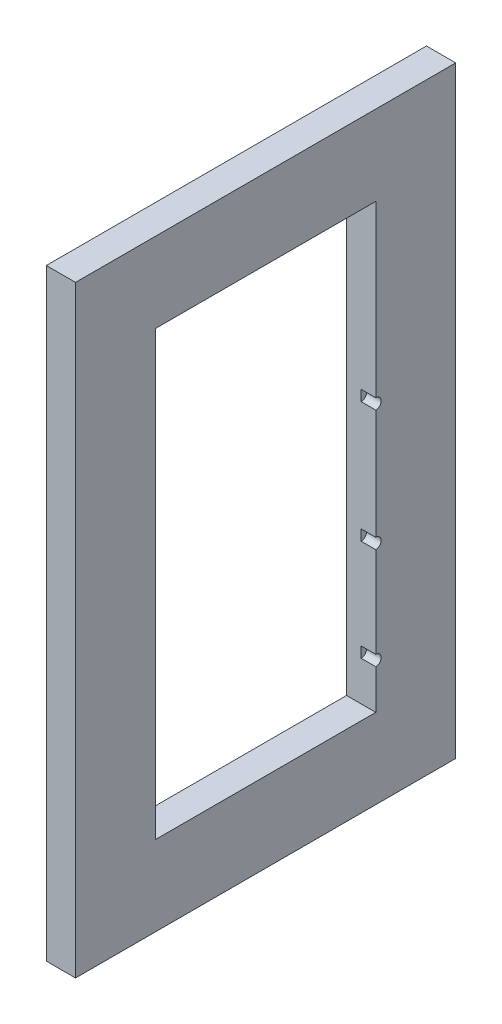
ISO-10303-21;
HEADER;
FILE_DESCRIPTION(('STEP AP214'),'2;1');
FILE_NAME('part.step','',(''),(''),'','','');
FILE_SCHEMA(('AUTOMOTIVE_DESIGN { 1 0 10303 214 1 1 1 1 }'));
ENDSEC;
DATA;
#1=APPLICATION_CONTEXT('core data for automotive mechanical design processes');
#2=APPLICATION_PROTOCOL_DEFINITION('international standard','automotive_design',2000,#1);
#3=PRODUCT_CONTEXT('',#1,'mechanical');
#4=PRODUCT('Part','Part','',(#3));
#5=PRODUCT_RELATED_PRODUCT_CATEGORY('part','',(#4));
#6=PRODUCT_DEFINITION_FORMATION('','',#4);
#7=PRODUCT_DEFINITION_CONTEXT('part definition',#1,'design');
#8=PRODUCT_DEFINITION('design','',#6,#7);
#9=PRODUCT_DEFINITION_SHAPE('','',#8);
#10=(LENGTH_UNIT() NAMED_UNIT(*) SI_UNIT(.MILLI.,.METRE.));
#11=(NAMED_UNIT(*) PLANE_ANGLE_UNIT() SI_UNIT($,.RADIAN.));
#12=(NAMED_UNIT(*) SI_UNIT($,.STERADIAN.) SOLID_ANGLE_UNIT());
#13=UNCERTAINTY_MEASURE_WITH_UNIT(LENGTH_MEASURE(1.E-05),#10,'distance_accuracy_value','');
#14=(GEOMETRIC_REPRESENTATION_CONTEXT(3) GLOBAL_UNCERTAINTY_ASSIGNED_CONTEXT((#13)) GLOBAL_UNIT_ASSIGNED_CONTEXT((#10,
#11,#12)) REPRESENTATION_CONTEXT('',''));
#15=CARTESIAN_POINT('',(0.,0.,0.));
#16=DIRECTION('',(0.,0.,1.));
#17=DIRECTION('',(1.,0.,0.));
#18=AXIS2_PLACEMENT_3D('',#15,#16,#17);
#19=CARTESIAN_POINT('',(15.,0.,0.));
#20=DIRECTION('',(-1.,0.,0.));
#21=DIRECTION('',(0.,0.,1.));
#22=AXIS2_PLACEMENT_3D('',#19,#20,#21);
#23=PLANE('',#22);
#24=DIRECTION('',(0.,0.,-1.));
#25=VECTOR('',#24,1.);
#26=CARTESIAN_POINT('',(15.,0.,0.));
#27=LINE('',#26,#25);
#28=CARTESIAN_POINT('',(15.,0.,195.));
#29=VERTEX_POINT('',#28);
#30=CARTESIAN_POINT('',(15.,0.,0.));
#31=VERTEX_POINT('',#30);
#32=EDGE_CURVE('E296',#29,#31,#27,.T.);
#33=ORIENTED_EDGE('',*,*,#32,.T.);
#34=DIRECTION('',(0.,1.,0.));
#35=VECTOR('',#34,1.);
#36=CARTESIAN_POINT('',(15.,0.,0.));
#37=LINE('',#36,#35);
#38=CARTESIAN_POINT('',(15.,309.,0.));
#39=VERTEX_POINT('',#38);
#40=EDGE_CURVE('E313',#31,#39,#37,.T.);
#41=ORIENTED_EDGE('',*,*,#40,.T.);
#42=DIRECTION('',(0.,0.,1.));
#43=VECTOR('',#42,1.);
#44=CARTESIAN_POINT('',(15.,309.,0.));
#45=LINE('',#44,#43);
#46=CARTESIAN_POINT('',(15.,309.,195.));
#47=VERTEX_POINT('',#46);
#48=EDGE_CURVE('E286',#39,#47,#45,.T.);
#49=ORIENTED_EDGE('',*,*,#48,.T.);
#50=DIRECTION('',(0.,-1.,0.));
#51=VECTOR('',#50,1.);
#52=CARTESIAN_POINT('',(15.,0.,195.));
#53=LINE('',#52,#51);
#54=EDGE_CURVE('E304',#47,#29,#53,.T.);
#55=ORIENTED_EDGE('',*,*,#54,.T.);
#56=EDGE_LOOP('',(#33,#41,#49,#55));
#57=FACE_BOUND('',#56,.T.);
#58=DIRECTION('',(0.,1.,0.));
#59=VECTOR('',#58,1.);
#60=CARTESIAN_POINT('',(15.,41.,41.));
#61=LINE('',#60,#59);
#62=CARTESIAN_POINT('',(15.,66.7499999999999,41.));
#63=VERTEX_POINT('',#62);
#64=CARTESIAN_POINT('',(15.,113.25,41.));
#65=VERTEX_POINT('',#64);
#66=EDGE_CURVE('E180',#63,#65,#61,.T.);
#67=ORIENTED_EDGE('',*,*,#66,.F.);
#68=CARTESIAN_POINT('',(15.,63.9999999999999,41.));
#69=DIRECTION('',(1.,0.,0.));
#70=DIRECTION('',(0.,0.,-1.));
#71=AXIS2_PLACEMENT_3D('',#68,#69,#70);
#72=CIRCLE('',#71,2.75000000000001);
#73=CARTESIAN_POINT('',(15.,61.2499999999999,41.));
#74=VERTEX_POINT('',#73);
#75=EDGE_CURVE('E199',#74,#63,#72,.T.);
#76=ORIENTED_EDGE('',*,*,#75,.F.);
#77=CARTESIAN_POINT('',(15.,41.,41.));
#78=VERTEX_POINT('',#77);
#79=EDGE_CURVE('E177',#78,#74,#61,.T.);
#80=ORIENTED_EDGE('',*,*,#79,.F.);
#81=DIRECTION('',(0.,0.,-1.));
#82=VECTOR('',#81,1.);
#83=CARTESIAN_POINT('',(15.,41.,154.));
#84=LINE('',#83,#82);
#85=CARTESIAN_POINT('',(15.,41.,154.));
#86=VERTEX_POINT('',#85);
#87=EDGE_CURVE('E175',#86,#78,#84,.T.);
#88=ORIENTED_EDGE('',*,*,#87,.F.);
#89=DIRECTION('',(0.,-1.,0.));
#90=VECTOR('',#89,1.);
#91=CARTESIAN_POINT('',(15.,41.,154.));
#92=LINE('',#91,#90);
#93=CARTESIAN_POINT('',(15.,268.,154.));
#94=VERTEX_POINT('',#93);
#95=EDGE_CURVE('E190',#94,#86,#92,.T.);
#96=ORIENTED_EDGE('',*,*,#95,.F.);
#97=DIRECTION('',(0.,0.,1.));
#98=VECTOR('',#97,1.);
#99=CARTESIAN_POINT('',(15.,268.,154.));
#100=LINE('',#99,#98);
#101=CARTESIAN_POINT('',(15.,268.,41.));
#102=VERTEX_POINT('',#101);
#103=EDGE_CURVE('E172',#102,#94,#100,.T.);
#104=ORIENTED_EDGE('',*,*,#103,.F.);
#105=CARTESIAN_POINT('',(15.,180.75,41.));
#106=VERTEX_POINT('',#105);
#107=EDGE_CURVE('E163',#106,#102,#61,.T.);
#108=ORIENTED_EDGE('',*,*,#107,.F.);
#109=CARTESIAN_POINT('',(15.,178.,41.));
#110=DIRECTION('',(1.,0.,0.));
#111=DIRECTION('',(0.,0.,-1.));
#112=AXIS2_PLACEMENT_3D('',#109,#110,#111);
#113=CIRCLE('',#112,2.75000000000001);
#114=CARTESIAN_POINT('',(15.,175.25,41.));
#115=VERTEX_POINT('',#114);
#116=EDGE_CURVE('E145',#115,#106,#113,.T.);
#117=ORIENTED_EDGE('',*,*,#116,.F.);
#118=CARTESIAN_POINT('',(15.,118.75,41.));
#119=VERTEX_POINT('',#118);
#120=EDGE_CURVE('E174',#119,#115,#61,.T.);
#121=ORIENTED_EDGE('',*,*,#120,.F.);
#122=CARTESIAN_POINT('',(15.,116.,41.));
#123=DIRECTION('',(1.,0.,0.));
#124=DIRECTION('',(0.,0.,-1.));
#125=AXIS2_PLACEMENT_3D('',#122,#123,#124);
#126=CIRCLE('',#125,2.75000000000001);
#127=EDGE_CURVE('E200',#65,#119,#126,.T.);
#128=ORIENTED_EDGE('',*,*,#127,.F.);
#129=EDGE_LOOP('',(#67,#76,#80,#88,#96,#104,#108,#117,#121,#128));
#130=FACE_BOUND('',#129,.T.);
#131=ADVANCED_FACE('F44',(#57,#130),#23,.F.);
#132=CARTESIAN_POINT('',(0.,0.,0.));
#133=DIRECTION('',(-1.,0.,0.));
#134=DIRECTION('',(0.,0.,1.));
#135=AXIS2_PLACEMENT_3D('',#132,#133,#134);
#136=PLANE('',#135);
#137=DIRECTION('',(0.,0.,-1.));
#138=VECTOR('',#137,1.);
#139=CARTESIAN_POINT('',(0.,0.,0.));
#140=LINE('',#139,#138);
#141=CARTESIAN_POINT('',(0.,0.,195.));
#142=VERTEX_POINT('',#141);
#143=CARTESIAN_POINT('',(0.,0.,0.));
#144=VERTEX_POINT('',#143);
#145=EDGE_CURVE('E282',#142,#144,#140,.T.);
#146=ORIENTED_EDGE('',*,*,#145,.F.);
#147=DIRECTION('',(0.,-1.,0.));
#148=VECTOR('',#147,1.);
#149=CARTESIAN_POINT('',(0.,0.,195.));
#150=LINE('',#149,#148);
#151=CARTESIAN_POINT('',(0.,309.,195.));
#152=VERTEX_POINT('',#151);
#153=EDGE_CURVE('E292',#152,#142,#150,.T.);
#154=ORIENTED_EDGE('',*,*,#153,.F.);
#155=DIRECTION('',(0.,0.,1.));
#156=VECTOR('',#155,1.);
#157=CARTESIAN_POINT('',(0.,309.,0.));
#158=LINE('',#157,#156);
#159=CARTESIAN_POINT('',(0.,309.,0.));
#160=VERTEX_POINT('',#159);
#161=EDGE_CURVE('E281',#160,#152,#158,.T.);
#162=ORIENTED_EDGE('',*,*,#161,.F.);
#163=DIRECTION('',(0.,1.,0.));
#164=VECTOR('',#163,1.);
#165=CARTESIAN_POINT('',(0.,0.,0.));
#166=LINE('',#165,#164);
#167=EDGE_CURVE('E271',#144,#160,#166,.T.);
#168=ORIENTED_EDGE('',*,*,#167,.F.);
#169=EDGE_LOOP('',(#146,#154,#162,#168));
#170=FACE_BOUND('',#169,.T.);
#171=DIRECTION('',(0.,-1.,0.));
#172=VECTOR('',#171,1.);
#173=CARTESIAN_POINT('',(0.,41.,154.));
#174=LINE('',#173,#172);
#175=CARTESIAN_POINT('',(0.,268.,154.));
#176=VERTEX_POINT('',#175);
#177=CARTESIAN_POINT('',(0.,41.,154.));
#178=VERTEX_POINT('',#177);
#179=EDGE_CURVE('E181',#176,#178,#174,.T.);
#180=ORIENTED_EDGE('',*,*,#179,.T.);
#181=DIRECTION('',(0.,0.,-1.));
#182=VECTOR('',#181,1.);
#183=CARTESIAN_POINT('',(0.,41.,154.));
#184=LINE('',#183,#182);
#185=CARTESIAN_POINT('',(0.,41.,41.));
#186=VERTEX_POINT('',#185);
#187=EDGE_CURVE('E349',#178,#186,#184,.T.);
#188=ORIENTED_EDGE('',*,*,#187,.T.);
#189=DIRECTION('',(0.,1.,0.));
#190=VECTOR('',#189,1.);
#191=CARTESIAN_POINT('',(0.,41.,41.));
#192=LINE('',#191,#190);
#193=CARTESIAN_POINT('',(0.,268.,41.));
#194=VERTEX_POINT('',#193);
#195=EDGE_CURVE('E345',#186,#194,#192,.T.);
#196=ORIENTED_EDGE('',*,*,#195,.T.);
#197=DIRECTION('',(0.,0.,1.));
#198=VECTOR('',#197,1.);
#199=CARTESIAN_POINT('',(0.,268.,154.));
#200=LINE('',#199,#198);
#201=EDGE_CURVE('E341',#194,#176,#200,.T.);
#202=ORIENTED_EDGE('',*,*,#201,.T.);
#203=EDGE_LOOP('',(#180,#188,#196,#202));
#204=FACE_BOUND('',#203,.T.);
#205=ADVANCED_FACE('F240',(#170,#204),#136,.T.);
#206=CARTESIAN_POINT('',(15.,0.,0.));
#207=DIRECTION('',(0.,1.,0.));
#208=DIRECTION('',(0.,0.,1.));
#209=AXIS2_PLACEMENT_3D('',#206,#207,#208);
#210=PLANE('',#209);
#211=ORIENTED_EDGE('',*,*,#145,.T.);
#212=DIRECTION('',(-1.,0.,0.));
#213=VECTOR('',#212,1.);
#214=CARTESIAN_POINT('',(15.,0.,0.));
#215=LINE('',#214,#213);
#216=EDGE_CURVE('E276',#31,#144,#215,.T.);
#217=ORIENTED_EDGE('',*,*,#216,.F.);
#218=ORIENTED_EDGE('',*,*,#32,.F.);
#219=DIRECTION('',(-1.,0.,0.));
#220=VECTOR('',#219,1.);
#221=CARTESIAN_POINT('',(15.,0.,195.));
#222=LINE('',#221,#220);
#223=EDGE_CURVE('E300',#29,#142,#222,.T.);
#224=ORIENTED_EDGE('',*,*,#223,.T.);
#225=EDGE_LOOP('',(#211,#217,#218,#224));
#226=FACE_BOUND('',#225,.T.);
#227=ADVANCED_FACE('F46',(#226),#210,.F.);
#228=CARTESIAN_POINT('',(15.,0.,0.));
#229=DIRECTION('',(0.,0.,1.));
#230=DIRECTION('',(1.,0.,0.));
#231=AXIS2_PLACEMENT_3D('',#228,#229,#230);
#232=PLANE('',#231);
#233=ORIENTED_EDGE('',*,*,#167,.T.);
#234=DIRECTION('',(-1.,0.,0.));
#235=VECTOR('',#234,1.);
#236=CARTESIAN_POINT('',(15.,309.,0.));
#237=LINE('',#236,#235);
#238=EDGE_CURVE('E273',#39,#160,#237,.T.);
#239=ORIENTED_EDGE('',*,*,#238,.F.);
#240=ORIENTED_EDGE('',*,*,#40,.F.);
#241=ORIENTED_EDGE('',*,*,#216,.T.);
#242=EDGE_LOOP('',(#233,#239,#240,#241));
#243=FACE_BOUND('',#242,.T.);
#244=ADVANCED_FACE('F261',(#243),#232,.F.);
#245=CARTESIAN_POINT('',(15.,309.,0.));
#246=DIRECTION('',(0.,-1.,0.));
#247=DIRECTION('',(0.,0.,-1.));
#248=AXIS2_PLACEMENT_3D('',#245,#246,#247);
#249=PLANE('',#248);
#250=ORIENTED_EDGE('',*,*,#161,.T.);
#251=DIRECTION('',(-1.,0.,0.));
#252=VECTOR('',#251,1.);
#253=CARTESIAN_POINT('',(15.,309.,195.));
#254=LINE('',#253,#252);
#255=EDGE_CURVE('E288',#47,#152,#254,.T.);
#256=ORIENTED_EDGE('',*,*,#255,.F.);
#257=ORIENTED_EDGE('',*,*,#48,.F.);
#258=ORIENTED_EDGE('',*,*,#238,.T.);
#259=EDGE_LOOP('',(#250,#256,#257,#258));
#260=FACE_BOUND('',#259,.T.);
#261=ADVANCED_FACE('F258',(#260),#249,.F.);
#262=CARTESIAN_POINT('',(15.,0.,195.));
#263=DIRECTION('',(0.,0.,-1.));
#264=DIRECTION('',(-1.,0.,0.));
#265=AXIS2_PLACEMENT_3D('',#262,#263,#264);
#266=PLANE('',#265);
#267=ORIENTED_EDGE('',*,*,#153,.T.);
#268=ORIENTED_EDGE('',*,*,#223,.F.);
#269=ORIENTED_EDGE('',*,*,#54,.F.);
#270=ORIENTED_EDGE('',*,*,#255,.T.);
#271=EDGE_LOOP('',(#267,#268,#269,#270));
#272=FACE_BOUND('',#271,.T.);
#273=ADVANCED_FACE('F255',(#272),#266,.F.);
#274=CARTESIAN_POINT('',(15.,41.,154.));
#275=DIRECTION('',(0.,1.,0.));
#276=DIRECTION('',(0.,0.,1.));
#277=AXIS2_PLACEMENT_3D('',#274,#275,#276);
#278=PLANE('',#277);
#279=ORIENTED_EDGE('',*,*,#187,.F.);
#280=DIRECTION('',(-1.,0.,0.));
#281=VECTOR('',#280,1.);
#282=CARTESIAN_POINT('',(15.,41.,154.));
#283=LINE('',#282,#281);
#284=EDGE_CURVE('E332',#86,#178,#283,.T.);
#285=ORIENTED_EDGE('',*,*,#284,.F.);
#286=ORIENTED_EDGE('',*,*,#87,.T.);
#287=DIRECTION('',(-1.,0.,0.));
#288=VECTOR('',#287,1.);
#289=CARTESIAN_POINT('',(15.,41.,41.));
#290=LINE('',#289,#288);
#291=EDGE_CURVE('E320',#78,#186,#290,.T.);
#292=ORIENTED_EDGE('',*,*,#291,.T.);
#293=EDGE_LOOP('',(#279,#285,#286,#292));
#294=FACE_BOUND('',#293,.T.);
#295=ADVANCED_FACE('F252',(#294),#278,.T.);
#296=CARTESIAN_POINT('',(15.,41.,41.));
#297=DIRECTION('',(0.,0.,1.));
#298=DIRECTION('',(1.,0.,0.));
#299=AXIS2_PLACEMENT_3D('',#296,#297,#298);
#300=PLANE('',#299);
#301=DIRECTION('',(1.,0.,0.));
#302=VECTOR('',#301,1.);
#303=CARTESIAN_POINT('',(7.5,61.2499999999999,41.));
#304=LINE('',#303,#302);
#305=CARTESIAN_POINT('',(7.5,61.2499999999999,41.));
#306=VERTEX_POINT('',#305);
#307=EDGE_CURVE('E11',#306,#74,#304,.T.);
#308=ORIENTED_EDGE('',*,*,#307,.F.);
#309=DIRECTION('',(0.,1.,0.));
#310=VECTOR('',#309,1.);
#311=CARTESIAN_POINT('',(7.5,41.,41.));
#312=LINE('',#311,#310);
#313=CARTESIAN_POINT('',(7.5,66.7499999999999,41.));
#314=VERTEX_POINT('',#313);
#315=EDGE_CURVE('E226',#306,#314,#312,.T.);
#316=ORIENTED_EDGE('',*,*,#315,.T.);
#317=DIRECTION('',(1.,0.,0.));
#318=VECTOR('',#317,1.);
#319=CARTESIAN_POINT('',(7.5,66.7499999999999,41.));
#320=LINE('',#319,#318);
#321=EDGE_CURVE('E53',#63,#314,#320,.F.);
#322=ORIENTED_EDGE('',*,*,#321,.F.);
#323=ORIENTED_EDGE('',*,*,#66,.T.);
#324=DIRECTION('',(1.,0.,0.));
#325=VECTOR('',#324,1.);
#326=CARTESIAN_POINT('',(7.5,113.25,41.));
#327=LINE('',#326,#325);
#328=CARTESIAN_POINT('',(7.5,113.25,41.));
#329=VERTEX_POINT('',#328);
#330=EDGE_CURVE('E195',#329,#65,#327,.T.);
#331=ORIENTED_EDGE('',*,*,#330,.F.);
#332=DIRECTION('',(0.,1.,0.));
#333=VECTOR('',#332,1.);
#334=CARTESIAN_POINT('',(7.5,41.,41.));
#335=LINE('',#334,#333);
#336=CARTESIAN_POINT('',(7.5,118.75,41.));
#337=VERTEX_POINT('',#336);
#338=EDGE_CURVE('E215',#329,#337,#335,.T.);
#339=ORIENTED_EDGE('',*,*,#338,.T.);
#340=DIRECTION('',(1.,0.,0.));
#341=VECTOR('',#340,1.);
#342=CARTESIAN_POINT('',(7.5,118.75,41.));
#343=LINE('',#342,#341);
#344=EDGE_CURVE('E218',#119,#337,#343,.F.);
#345=ORIENTED_EDGE('',*,*,#344,.F.);
#346=ORIENTED_EDGE('',*,*,#120,.T.);
#347=DIRECTION('',(1.,0.,0.));
#348=VECTOR('',#347,1.);
#349=CARTESIAN_POINT('',(7.5,175.25,41.));
#350=LINE('',#349,#348);
#351=CARTESIAN_POINT('',(7.5,175.25,41.));
#352=VERTEX_POINT('',#351);
#353=EDGE_CURVE('E152',#352,#115,#350,.T.);
#354=ORIENTED_EDGE('',*,*,#353,.F.);
#355=DIRECTION('',(0.,1.,0.));
#356=VECTOR('',#355,1.);
#357=CARTESIAN_POINT('',(7.5,41.,41.));
#358=LINE('',#357,#356);
#359=CARTESIAN_POINT('',(7.5,180.75,41.));
#360=VERTEX_POINT('',#359);
#361=EDGE_CURVE('E165',#352,#360,#358,.T.);
#362=ORIENTED_EDGE('',*,*,#361,.T.);
#363=DIRECTION('',(1.,0.,0.));
#364=VECTOR('',#363,1.);
#365=CARTESIAN_POINT('',(7.5,180.75,41.));
#366=LINE('',#365,#364);
#367=EDGE_CURVE('E149',#106,#360,#366,.F.);
#368=ORIENTED_EDGE('',*,*,#367,.F.);
#369=ORIENTED_EDGE('',*,*,#107,.T.);
#370=DIRECTION('',(-1.,0.,0.));
#371=VECTOR('',#370,1.);
#372=CARTESIAN_POINT('',(15.,268.,41.));
#373=LINE('',#372,#371);
#374=EDGE_CURVE('E325',#102,#194,#373,.T.);
#375=ORIENTED_EDGE('',*,*,#374,.T.);
#376=ORIENTED_EDGE('',*,*,#195,.F.);
#377=ORIENTED_EDGE('',*,*,#291,.F.);
#378=ORIENTED_EDGE('',*,*,#79,.T.);
#379=EDGE_LOOP('',(#308,#316,#322,#323,#331,#339,#345,#346,#354,#362,#368,#369,#375,#376,#377,#378));
#380=FACE_BOUND('',#379,.T.);
#381=ADVANCED_FACE('F162',(#380),#300,.T.);
#382=CARTESIAN_POINT('',(15.,268.,154.));
#383=DIRECTION('',(0.,-1.,0.));
#384=DIRECTION('',(0.,0.,-1.));
#385=AXIS2_PLACEMENT_3D('',#382,#383,#384);
#386=PLANE('',#385);
#387=ORIENTED_EDGE('',*,*,#201,.F.);
#388=ORIENTED_EDGE('',*,*,#374,.F.);
#389=ORIENTED_EDGE('',*,*,#103,.T.);
#390=DIRECTION('',(-1.,0.,0.));
#391=VECTOR('',#390,1.);
#392=CARTESIAN_POINT('',(15.,268.,154.));
#393=LINE('',#392,#391);
#394=EDGE_CURVE('E329',#94,#176,#393,.T.);
#395=ORIENTED_EDGE('',*,*,#394,.T.);
#396=EDGE_LOOP('',(#387,#388,#389,#395));
#397=FACE_BOUND('',#396,.T.);
#398=ADVANCED_FACE('F359',(#397),#386,.T.);
#399=CARTESIAN_POINT('',(15.,41.,154.));
#400=DIRECTION('',(0.,0.,-1.));
#401=DIRECTION('',(-1.,0.,0.));
#402=AXIS2_PLACEMENT_3D('',#399,#400,#401);
#403=PLANE('',#402);
#404=ORIENTED_EDGE('',*,*,#179,.F.);
#405=ORIENTED_EDGE('',*,*,#394,.F.);
#406=ORIENTED_EDGE('',*,*,#95,.T.);
#407=ORIENTED_EDGE('',*,*,#284,.T.);
#408=EDGE_LOOP('',(#404,#405,#406,#407));
#409=FACE_BOUND('',#408,.T.);
#410=ADVANCED_FACE('F356',(#409),#403,.T.);
#411=CARTESIAN_POINT('',(7.5,178.,41.));
#412=DIRECTION('',(1.,0.,0.));
#413=DIRECTION('',(0.,0.,-1.));
#414=AXIS2_PLACEMENT_3D('',#411,#412,#413);
#415=CYLINDRICAL_SURFACE('',#414,2.75000000000001);
#416=ORIENTED_EDGE('',*,*,#353,.T.);
#417=ORIENTED_EDGE('',*,*,#116,.T.);
#418=ORIENTED_EDGE('',*,*,#367,.T.);
#419=CARTESIAN_POINT('',(7.5,178.,41.));
#420=DIRECTION('',(1.,0.,0.));
#421=DIRECTION('',(0.,0.,-1.));
#422=AXIS2_PLACEMENT_3D('',#419,#420,#421);
#423=CIRCLE('',#422,2.75000000000001);
#424=EDGE_CURVE('E158',#352,#360,#423,.T.);
#425=ORIENTED_EDGE('',*,*,#424,.F.);
#426=EDGE_LOOP('',(#416,#417,#418,#425));
#427=FACE_BOUND('',#426,.T.);
#428=ADVANCED_FACE('F147',(#427),#415,.F.);
#429=CARTESIAN_POINT('',(7.5,178.,41.));
#430=DIRECTION('',(1.,0.,0.));
#431=DIRECTION('',(0.,0.,-1.));
#432=AXIS2_PLACEMENT_3D('',#429,#430,#431);
#433=PLANE('',#432);
#434=ORIENTED_EDGE('',*,*,#424,.T.);
#435=ORIENTED_EDGE('',*,*,#361,.F.);
#436=EDGE_LOOP('',(#434,#435));
#437=FACE_BOUND('',#436,.T.);
#438=ADVANCED_FACE('F213',(#437),#433,.T.);
#439=CARTESIAN_POINT('',(7.5,116.,41.));
#440=DIRECTION('',(1.,0.,0.));
#441=DIRECTION('',(0.,0.,-1.));
#442=AXIS2_PLACEMENT_3D('',#439,#440,#441);
#443=CYLINDRICAL_SURFACE('',#442,2.75000000000001);
#444=ORIENTED_EDGE('',*,*,#330,.T.);
#445=ORIENTED_EDGE('',*,*,#127,.T.);
#446=ORIENTED_EDGE('',*,*,#344,.T.);
#447=CARTESIAN_POINT('',(7.5,116.,41.));
#448=DIRECTION('',(1.,0.,0.));
#449=DIRECTION('',(0.,0.,-1.));
#450=AXIS2_PLACEMENT_3D('',#447,#448,#449);
#451=CIRCLE('',#450,2.75000000000001);
#452=EDGE_CURVE('E66',#329,#337,#451,.T.);
#453=ORIENTED_EDGE('',*,*,#452,.F.);
#454=EDGE_LOOP('',(#444,#445,#446,#453));
#455=FACE_BOUND('',#454,.T.);
#456=ADVANCED_FACE('F369',(#455),#443,.F.);
#457=CARTESIAN_POINT('',(7.5,116.,41.));
#458=DIRECTION('',(1.,0.,0.));
#459=DIRECTION('',(0.,0.,-1.));
#460=AXIS2_PLACEMENT_3D('',#457,#458,#459);
#461=PLANE('',#460);
#462=ORIENTED_EDGE('',*,*,#452,.T.);
#463=ORIENTED_EDGE('',*,*,#338,.F.);
#464=EDGE_LOOP('',(#462,#463));
#465=FACE_BOUND('',#464,.T.);
#466=ADVANCED_FACE('F237',(#465),#461,.T.);
#467=CARTESIAN_POINT('',(7.5,63.9999999999999,41.));
#468=DIRECTION('',(1.,0.,0.));
#469=DIRECTION('',(0.,0.,-1.));
#470=AXIS2_PLACEMENT_3D('',#467,#468,#469);
#471=CYLINDRICAL_SURFACE('',#470,2.75000000000001);
#472=ORIENTED_EDGE('',*,*,#307,.T.);
#473=ORIENTED_EDGE('',*,*,#75,.T.);
#474=ORIENTED_EDGE('',*,*,#321,.T.);
#475=CARTESIAN_POINT('',(7.5,63.9999999999999,41.));
#476=DIRECTION('',(1.,0.,0.));
#477=DIRECTION('',(0.,0.,-1.));
#478=AXIS2_PLACEMENT_3D('',#475,#476,#477);
#479=CIRCLE('',#478,2.75000000000001);
#480=EDGE_CURVE('E59',#306,#314,#479,.T.);
#481=ORIENTED_EDGE('',*,*,#480,.F.);
#482=EDGE_LOOP('',(#472,#473,#474,#481));
#483=FACE_BOUND('',#482,.T.);
#484=ADVANCED_FACE('F230',(#483),#471,.F.);
#485=CARTESIAN_POINT('',(7.5,0.,0.));
#486=DIRECTION('',(1.,0.,0.));
#487=DIRECTION('',(0.,0.,-1.));
#488=AXIS2_PLACEMENT_3D('',#485,#486,#487);
#489=PLANE('',#488);
#490=ORIENTED_EDGE('',*,*,#480,.T.);
#491=ORIENTED_EDGE('',*,*,#315,.F.);
#492=EDGE_LOOP('',(#490,#491));
#493=FACE_BOUND('',#492,.T.);
#494=ADVANCED_FACE('F231',(#493),#489,.T.);
#495=CLOSED_SHELL('',(#131,#205,#227,#244,#261,#273,#295,#381,#398,#410,#428,#438,#456,#466,
#484,#494));
#496=MANIFOLD_SOLID_BREP('B2',#495);
#497=ADVANCED_BREP_SHAPE_REPRESENTATION('',(#18,#496),#14);
#498=SHAPE_DEFINITION_REPRESENTATION(#9,#497);
ENDSEC;
END-ISO-10303-21;
